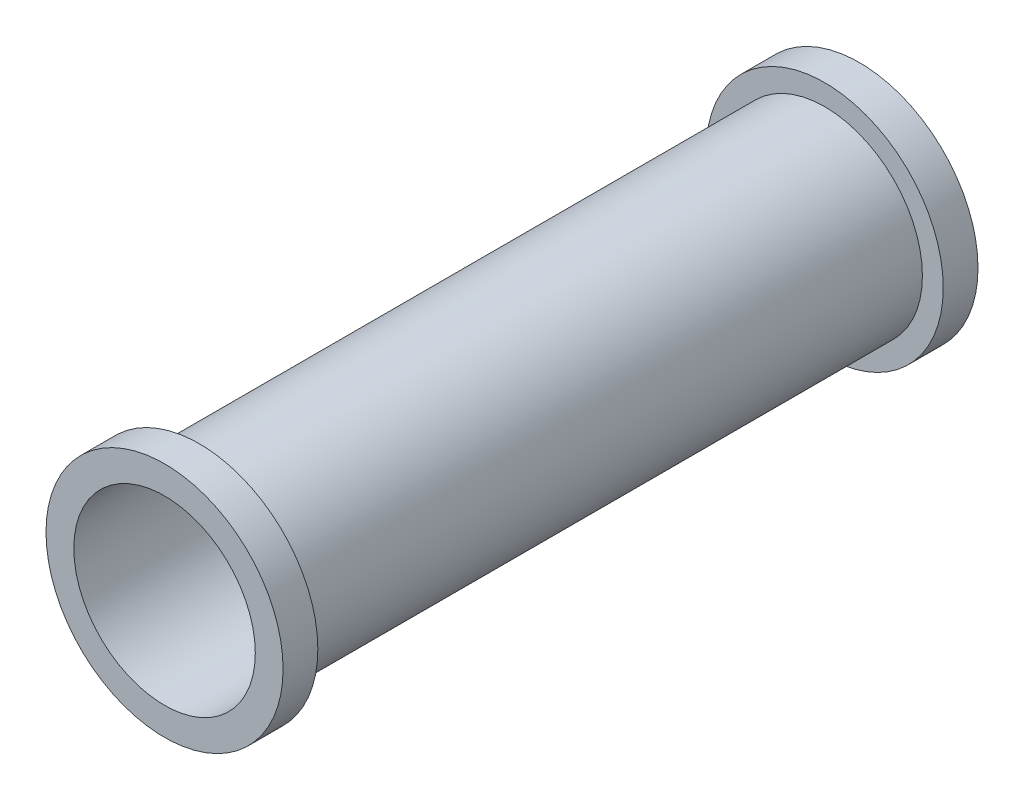
ISO-10303-21;
HEADER;
FILE_DESCRIPTION(('STEP AP214'),'2;1');
FILE_NAME('part.step','',(''),(''),'','','');
FILE_SCHEMA(('AUTOMOTIVE_DESIGN { 1 0 10303 214 1 1 1 1 }'));
ENDSEC;
DATA;
#1=APPLICATION_CONTEXT('core data for automotive mechanical design processes');
#2=APPLICATION_PROTOCOL_DEFINITION('international standard','automotive_design',2000,#1);
#3=PRODUCT_CONTEXT('',#1,'mechanical');
#4=PRODUCT('Part','Part','',(#3));
#5=PRODUCT_RELATED_PRODUCT_CATEGORY('part','',(#4));
#6=PRODUCT_DEFINITION_FORMATION('','',#4);
#7=PRODUCT_DEFINITION_CONTEXT('part definition',#1,'design');
#8=PRODUCT_DEFINITION('design','',#6,#7);
#9=PRODUCT_DEFINITION_SHAPE('','',#8);
#10=(LENGTH_UNIT() NAMED_UNIT(*) SI_UNIT(.MILLI.,.METRE.));
#11=(NAMED_UNIT(*) PLANE_ANGLE_UNIT() SI_UNIT($,.RADIAN.));
#12=(NAMED_UNIT(*) SI_UNIT($,.STERADIAN.) SOLID_ANGLE_UNIT());
#13=UNCERTAINTY_MEASURE_WITH_UNIT(LENGTH_MEASURE(1.E-05),#10,'distance_accuracy_value','');
#14=(GEOMETRIC_REPRESENTATION_CONTEXT(3) GLOBAL_UNCERTAINTY_ASSIGNED_CONTEXT((#13)) GLOBAL_UNIT_ASSIGNED_CONTEXT((#10,
#11,#12)) REPRESENTATION_CONTEXT('',''));
#15=CARTESIAN_POINT('',(0.,0.,0.));
#16=DIRECTION('',(0.,0.,1.));
#17=DIRECTION('',(1.,0.,0.));
#18=AXIS2_PLACEMENT_3D('',#15,#16,#17);
#19=CARTESIAN_POINT('',(0.,0.,100.));
#20=DIRECTION('',(0.,0.,-1.));
#21=DIRECTION('',(-1.,0.,0.));
#22=AXIS2_PLACEMENT_3D('',#19,#20,#21);
#23=CYLINDRICAL_SURFACE('',#22,14.0590583242114);
#24=CARTESIAN_POINT('',(0.,0.,5.));
#25=DIRECTION('',(0.,0.,1.));
#26=DIRECTION('',(1.,0.,0.));
#27=AXIS2_PLACEMENT_3D('',#24,#25,#26);
#28=CIRCLE('',#27,14.0590583242114);
#29=CARTESIAN_POINT('',(14.0590583242114,0.,5.));
#30=VERTEX_POINT('',#29);
#31=EDGE_CURVE('E57',#30,#30,#28,.T.);
#32=ORIENTED_EDGE('',*,*,#31,.T.);
#33=EDGE_LOOP('',(#32));
#34=FACE_BOUND('',#33,.T.);
#35=CARTESIAN_POINT('',(0.,0.,95.0000000000001));
#36=DIRECTION('',(0.,0.,1.));
#37=DIRECTION('',(1.,0.,0.));
#38=AXIS2_PLACEMENT_3D('',#35,#36,#37);
#39=CIRCLE('',#38,14.0590583242114);
#40=CARTESIAN_POINT('',(14.0590583242114,0.,95.0000000000001));
#41=VERTEX_POINT('',#40);
#42=EDGE_CURVE('E11',#41,#41,#39,.T.);
#43=ORIENTED_EDGE('',*,*,#42,.F.);
#44=EDGE_LOOP('',(#43));
#45=FACE_BOUND('',#44,.T.);
#46=ADVANCED_FACE('F37',(#34,#45),#23,.T.);
#47=CARTESIAN_POINT('',(0.,0.,100.));
#48=DIRECTION('',(0.,0.,1.));
#49=DIRECTION('',(1.,0.,0.));
#50=AXIS2_PLACEMENT_3D('',#47,#48,#49);
#51=PLANE('',#50);
#52=CARTESIAN_POINT('',(0.,0.,100.));
#53=DIRECTION('',(0.,0.,1.));
#54=DIRECTION('',(1.,0.,0.));
#55=AXIS2_PLACEMENT_3D('',#52,#53,#54);
#56=CIRCLE('',#55,13.0590583242114);
#57=CARTESIAN_POINT('',(13.0590583242114,0.,100.));
#58=VERTEX_POINT('',#57);
#59=EDGE_CURVE('E43',#58,#58,#56,.T.);
#60=ORIENTED_EDGE('',*,*,#59,.F.);
#61=EDGE_LOOP('',(#60));
#62=FACE_BOUND('',#61,.T.);
#63=CARTESIAN_POINT('',(0.,0.,100.));
#64=DIRECTION('',(0.,0.,1.));
#65=DIRECTION('',(1.,0.,0.));
#66=AXIS2_PLACEMENT_3D('',#63,#64,#65);
#67=CIRCLE('',#66,17.0590583242105);
#68=CARTESIAN_POINT('',(17.0590583242105,0.,100.));
#69=VERTEX_POINT('',#68);
#70=EDGE_CURVE('E63',#69,#69,#67,.T.);
#71=ORIENTED_EDGE('',*,*,#70,.T.);
#72=EDGE_LOOP('',(#71));
#73=FACE_BOUND('',#72,.T.);
#74=ADVANCED_FACE('F81',(#62,#73),#51,.T.);
#75=CARTESIAN_POINT('',(0.,0.,0.));
#76=DIRECTION('',(0.,0.,1.));
#77=DIRECTION('',(1.,0.,0.));
#78=AXIS2_PLACEMENT_3D('',#75,#76,#77);
#79=PLANE('',#78);
#80=CARTESIAN_POINT('',(0.,0.,0.));
#81=DIRECTION('',(0.,0.,1.));
#82=DIRECTION('',(1.,0.,0.));
#83=AXIS2_PLACEMENT_3D('',#80,#81,#82);
#84=CIRCLE('',#83,13.0590583242114);
#85=CARTESIAN_POINT('',(13.0590583242114,0.,0.));
#86=VERTEX_POINT('',#85);
#87=EDGE_CURVE('E47',#86,#86,#84,.T.);
#88=ORIENTED_EDGE('',*,*,#87,.T.);
#89=EDGE_LOOP('',(#88));
#90=FACE_BOUND('',#89,.T.);
#91=CARTESIAN_POINT('',(0.,0.,0.));
#92=DIRECTION('',(0.,0.,1.));
#93=DIRECTION('',(1.,0.,0.));
#94=AXIS2_PLACEMENT_3D('',#91,#92,#93);
#95=CIRCLE('',#94,17.0590583242114);
#96=CARTESIAN_POINT('',(17.0590583242114,0.,0.));
#97=VERTEX_POINT('',#96);
#98=EDGE_CURVE('E54',#97,#97,#95,.T.);
#99=ORIENTED_EDGE('',*,*,#98,.F.);
#100=EDGE_LOOP('',(#99));
#101=FACE_BOUND('',#100,.T.);
#102=ADVANCED_FACE('F86',(#90,#101),#79,.F.);
#103=CARTESIAN_POINT('',(0.,0.,100.));
#104=DIRECTION('',(0.,0.,-1.));
#105=DIRECTION('',(-1.,0.,0.));
#106=AXIS2_PLACEMENT_3D('',#103,#104,#105);
#107=CYLINDRICAL_SURFACE('',#106,13.0590583242114);
#108=ORIENTED_EDGE('',*,*,#59,.T.);
#109=EDGE_LOOP('',(#108));
#110=FACE_BOUND('',#109,.T.);
#111=ORIENTED_EDGE('',*,*,#87,.F.);
#112=EDGE_LOOP('',(#111));
#113=FACE_BOUND('',#112,.T.);
#114=ADVANCED_FACE('F100',(#110,#113),#107,.F.);
#115=CARTESIAN_POINT('',(0.,0.,5.));
#116=DIRECTION('',(0.,0.,-1.));
#117=DIRECTION('',(-1.,0.,0.));
#118=AXIS2_PLACEMENT_3D('',#115,#116,#117);
#119=CYLINDRICAL_SURFACE('',#118,17.0590583242114);
#120=CARTESIAN_POINT('',(0.,0.,5.));
#121=DIRECTION('',(0.,0.,1.));
#122=DIRECTION('',(1.,0.,0.));
#123=AXIS2_PLACEMENT_3D('',#120,#121,#122);
#124=CIRCLE('',#123,17.0590583242114);
#125=CARTESIAN_POINT('',(17.0590583242114,0.,5.));
#126=VERTEX_POINT('',#125);
#127=EDGE_CURVE('E52',#126,#126,#124,.T.);
#128=ORIENTED_EDGE('',*,*,#127,.F.);
#129=EDGE_LOOP('',(#128));
#130=FACE_BOUND('',#129,.T.);
#131=ORIENTED_EDGE('',*,*,#98,.T.);
#132=EDGE_LOOP('',(#131));
#133=FACE_BOUND('',#132,.T.);
#134=ADVANCED_FACE('F94',(#130,#133),#119,.T.);
#135=CARTESIAN_POINT('',(0.,0.,5.));
#136=DIRECTION('',(0.,0.,1.));
#137=DIRECTION('',(1.,0.,0.));
#138=AXIS2_PLACEMENT_3D('',#135,#136,#137);
#139=PLANE('',#138);
#140=ORIENTED_EDGE('',*,*,#31,.F.);
#141=EDGE_LOOP('',(#140));
#142=FACE_BOUND('',#141,.T.);
#143=ORIENTED_EDGE('',*,*,#127,.T.);
#144=EDGE_LOOP('',(#143));
#145=FACE_BOUND('',#144,.T.);
#146=ADVANCED_FACE('F78',(#142,#145),#139,.T.);
#147=CARTESIAN_POINT('',(0.,0.,95.0000000000001));
#148=DIRECTION('',(0.,0.,1.));
#149=DIRECTION('',(1.,0.,0.));
#150=AXIS2_PLACEMENT_3D('',#147,#148,#149);
#151=CYLINDRICAL_SURFACE('',#150,17.0590583242105);
#152=CARTESIAN_POINT('',(0.,0.,95.0000000000001));
#153=DIRECTION('',(0.,0.,1.));
#154=DIRECTION('',(1.,0.,0.));
#155=AXIS2_PLACEMENT_3D('',#152,#153,#154);
#156=CIRCLE('',#155,17.0590583242105);
#157=CARTESIAN_POINT('',(17.0590583242105,0.,95.0000000000001));
#158=VERTEX_POINT('',#157);
#159=EDGE_CURVE('E58',#158,#158,#156,.T.);
#160=ORIENTED_EDGE('',*,*,#159,.T.);
#161=EDGE_LOOP('',(#160));
#162=FACE_BOUND('',#161,.T.);
#163=ORIENTED_EDGE('',*,*,#70,.F.);
#164=EDGE_LOOP('',(#163));
#165=FACE_BOUND('',#164,.T.);
#166=ADVANCED_FACE('F69',(#162,#165),#151,.T.);
#167=CARTESIAN_POINT('',(0.,0.,95.0000000000001));
#168=DIRECTION('',(0.,0.,1.));
#169=DIRECTION('',(1.,0.,0.));
#170=AXIS2_PLACEMENT_3D('',#167,#168,#169);
#171=PLANE('',#170);
#172=ORIENTED_EDGE('',*,*,#42,.T.);
#173=EDGE_LOOP('',(#172));
#174=FACE_BOUND('',#173,.T.);
#175=ORIENTED_EDGE('',*,*,#159,.F.);
#176=EDGE_LOOP('',(#175));
#177=FACE_BOUND('',#176,.T.);
#178=ADVANCED_FACE('F72',(#174,#177),#171,.F.);
#179=CLOSED_SHELL('',(#46,#74,#102,#114,#134,#146,#166,#178));
#180=MANIFOLD_SOLID_BREP('B2',#179);
#181=ADVANCED_BREP_SHAPE_REPRESENTATION('',(#18,#180),#14);
#182=SHAPE_DEFINITION_REPRESENTATION(#9,#181);
ENDSEC;
END-ISO-10303-21;
